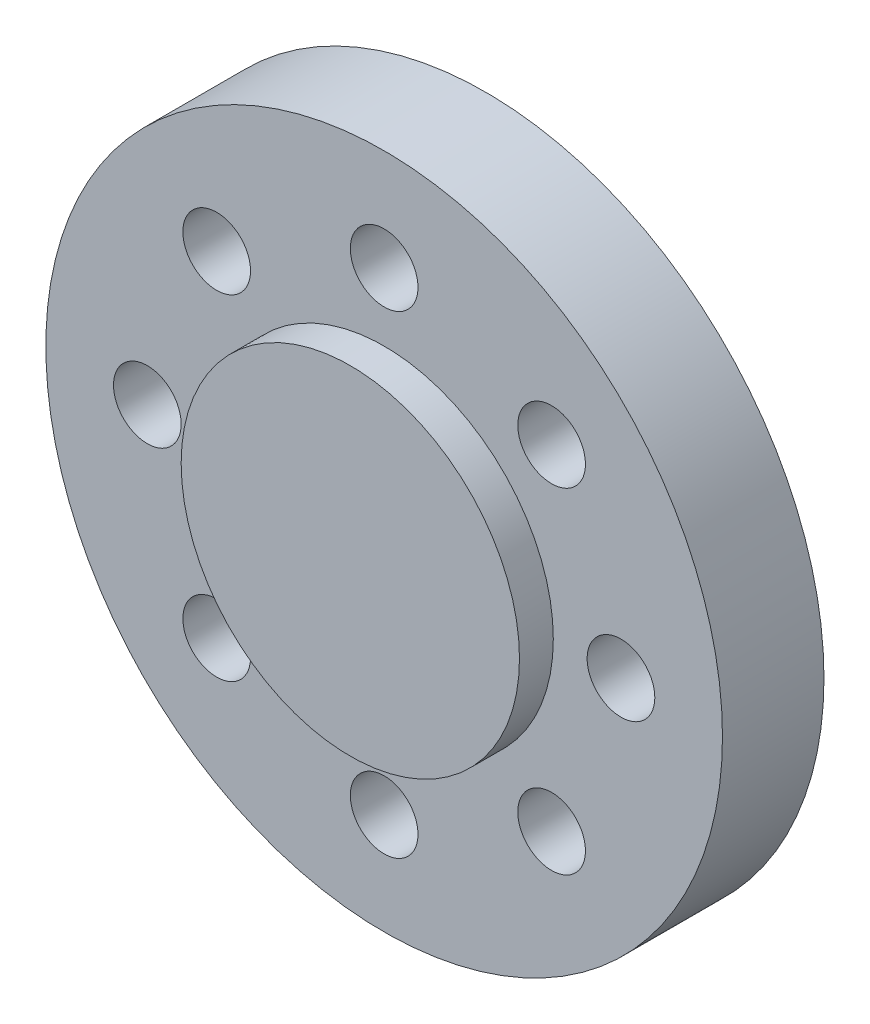
ISO-10303-21;
HEADER;
FILE_DESCRIPTION(('STEP AP214'),'2;1');
FILE_NAME('part.step','',(''),(''),'','','');
FILE_SCHEMA(('AUTOMOTIVE_DESIGN { 1 0 10303 214 1 1 1 1 }'));
ENDSEC;
DATA;
#1=APPLICATION_CONTEXT('core data for automotive mechanical design processes');
#2=APPLICATION_PROTOCOL_DEFINITION('international standard','automotive_design',2000,#1);
#3=PRODUCT_CONTEXT('',#1,'mechanical');
#4=PRODUCT('Part','Part','',(#3));
#5=PRODUCT_RELATED_PRODUCT_CATEGORY('part','',(#4));
#6=PRODUCT_DEFINITION_FORMATION('','',#4);
#7=PRODUCT_DEFINITION_CONTEXT('part definition',#1,'design');
#8=PRODUCT_DEFINITION('design','',#6,#7);
#9=PRODUCT_DEFINITION_SHAPE('','',#8);
#10=(LENGTH_UNIT() NAMED_UNIT(*) SI_UNIT(.MILLI.,.METRE.));
#11=(NAMED_UNIT(*) PLANE_ANGLE_UNIT() SI_UNIT($,.RADIAN.));
#12=(NAMED_UNIT(*) SI_UNIT($,.STERADIAN.) SOLID_ANGLE_UNIT());
#13=UNCERTAINTY_MEASURE_WITH_UNIT(LENGTH_MEASURE(1.E-05),#10,'distance_accuracy_value','');
#14=(GEOMETRIC_REPRESENTATION_CONTEXT(3) GLOBAL_UNCERTAINTY_ASSIGNED_CONTEXT((#13)) GLOBAL_UNIT_ASSIGNED_CONTEXT((#10,
#11,#12)) REPRESENTATION_CONTEXT('',''));
#15=CARTESIAN_POINT('',(0.,0.,0.));
#16=DIRECTION('',(0.,0.,1.));
#17=DIRECTION('',(1.,0.,0.));
#18=AXIS2_PLACEMENT_3D('',#15,#16,#17);
#19=CARTESIAN_POINT('',(13.5170920211287,-11.1544342507645,36.));
#20=DIRECTION('',(0.,0.,1.));
#21=DIRECTION('',(1.,0.,0.));
#22=AXIS2_PLACEMENT_3D('',#19,#20,#21);
#23=PLANE('',#22);
#24=CARTESIAN_POINT('',(18.4668394894346,-6.20468678245874,36.));
#25=DIRECTION('',(0.,0.,1.));
#26=DIRECTION('',(1.,0.,0.));
#27=AXIS2_PLACEMENT_3D('',#24,#25,#26);
#28=CIRCLE('',#27,1.);
#29=CARTESIAN_POINT('',(19.4668394894346,-6.20468678245874,36.));
#30=VERTEX_POINT('',#29);
#31=EDGE_CURVE('E98',#30,#30,#28,.T.);
#32=ORIENTED_EDGE('',*,*,#31,.F.);
#33=EDGE_LOOP('',(#32));
#34=FACE_BOUND('',#33,.T.);
#35=CARTESIAN_POINT('',(13.5170920211288,-4.15443425076452,36.));
#36=DIRECTION('',(0.,0.,1.));
#37=DIRECTION('',(1.,0.,0.));
#38=AXIS2_PLACEMENT_3D('',#35,#36,#37);
#39=CIRCLE('',#38,1.);
#40=CARTESIAN_POINT('',(14.5170920211288,-4.15443425076452,36.));
#41=VERTEX_POINT('',#40);
#42=EDGE_CURVE('E92',#41,#41,#39,.T.);
#43=ORIENTED_EDGE('',*,*,#42,.F.);
#44=EDGE_LOOP('',(#43));
#45=FACE_BOUND('',#44,.T.);
#46=CARTESIAN_POINT('',(8.56734455282293,-6.20468678245864,36.));
#47=DIRECTION('',(0.,0.,1.));
#48=DIRECTION('',(1.,0.,0.));
#49=AXIS2_PLACEMENT_3D('',#46,#47,#48);
#50=CIRCLE('',#49,1.);
#51=CARTESIAN_POINT('',(9.56734455282293,-6.20468678245864,36.));
#52=VERTEX_POINT('',#51);
#53=EDGE_CURVE('E86',#52,#52,#50,.T.);
#54=ORIENTED_EDGE('',*,*,#53,.F.);
#55=EDGE_LOOP('',(#54));
#56=FACE_BOUND('',#55,.T.);
#57=CARTESIAN_POINT('',(6.51709202112872,-11.1544342507645,36.));
#58=DIRECTION('',(0.,0.,1.));
#59=DIRECTION('',(1.,0.,0.));
#60=AXIS2_PLACEMENT_3D('',#57,#58,#59);
#61=CIRCLE('',#60,1.);
#62=CARTESIAN_POINT('',(7.51709202112872,-11.1544342507645,36.));
#63=VERTEX_POINT('',#62);
#64=EDGE_CURVE('E80',#63,#63,#61,.T.);
#65=ORIENTED_EDGE('',*,*,#64,.F.);
#66=EDGE_LOOP('',(#65));
#67=FACE_BOUND('',#66,.T.);
#68=CARTESIAN_POINT('',(8.56734455282286,-16.1041817190703,36.));
#69=DIRECTION('',(0.,0.,1.));
#70=DIRECTION('',(1.,0.,0.));
#71=AXIS2_PLACEMENT_3D('',#68,#69,#70);
#72=CIRCLE('',#71,1.);
#73=CARTESIAN_POINT('',(9.56734455282286,-16.1041817190703,36.));
#74=VERTEX_POINT('',#73);
#75=EDGE_CURVE('E74',#74,#74,#72,.T.);
#76=ORIENTED_EDGE('',*,*,#75,.F.);
#77=EDGE_LOOP('',(#76));
#78=FACE_BOUND('',#77,.T.);
#79=CARTESIAN_POINT('',(13.5170920211287,-18.1544342507645,36.));
#80=DIRECTION('',(0.,0.,1.));
#81=DIRECTION('',(1.,0.,0.));
#82=AXIS2_PLACEMENT_3D('',#79,#80,#81);
#83=CIRCLE('',#82,0.999999999999997);
#84=CARTESIAN_POINT('',(14.5170920211287,-18.1544342507645,36.));
#85=VERTEX_POINT('',#84);
#86=EDGE_CURVE('E68',#85,#85,#83,.T.);
#87=ORIENTED_EDGE('',*,*,#86,.F.);
#88=EDGE_LOOP('',(#87));
#89=FACE_BOUND('',#88,.T.);
#90=CARTESIAN_POINT('',(18.4668394894345,-16.1041817190704,36.));
#91=DIRECTION('',(0.,0.,1.));
#92=DIRECTION('',(1.,0.,0.));
#93=AXIS2_PLACEMENT_3D('',#90,#91,#92);
#94=CIRCLE('',#93,1.);
#95=CARTESIAN_POINT('',(19.4668394894345,-16.1041817190704,36.));
#96=VERTEX_POINT('',#95);
#97=EDGE_CURVE('E62',#96,#96,#94,.T.);
#98=ORIENTED_EDGE('',*,*,#97,.F.);
#99=EDGE_LOOP('',(#98));
#100=FACE_BOUND('',#99,.T.);
#101=CARTESIAN_POINT('',(20.5170920211287,-11.1544342507645,36.));
#102=DIRECTION('',(0.,0.,1.));
#103=DIRECTION('',(1.,0.,0.));
#104=AXIS2_PLACEMENT_3D('',#101,#102,#103);
#105=CIRCLE('',#104,1.);
#106=CARTESIAN_POINT('',(21.5170920211287,-11.1544342507645,36.));
#107=VERTEX_POINT('',#106);
#108=EDGE_CURVE('E56',#107,#107,#105,.T.);
#109=ORIENTED_EDGE('',*,*,#108,.F.);
#110=EDGE_LOOP('',(#109));
#111=FACE_BOUND('',#110,.T.);
#112=CARTESIAN_POINT('',(13.5170920211287,-11.1544342507645,36.));
#113=DIRECTION('',(0.,0.,1.));
#114=DIRECTION('',(1.,0.,0.));
#115=AXIS2_PLACEMENT_3D('',#112,#113,#114);
#116=CIRCLE('',#115,10.);
#117=CARTESIAN_POINT('',(23.5170920211287,-11.1544342507645,36.));
#118=VERTEX_POINT('',#117);
#119=EDGE_CURVE('E43',#118,#118,#116,.T.);
#120=ORIENTED_EDGE('',*,*,#119,.T.);
#121=EDGE_LOOP('',(#120));
#122=FACE_BOUND('',#121,.T.);
#123=CARTESIAN_POINT('',(13.5170920211287,-11.1544342507645,36.));
#124=DIRECTION('',(0.,0.,1.));
#125=DIRECTION('',(1.,0.,0.));
#126=AXIS2_PLACEMENT_3D('',#123,#124,#125);
#127=CIRCLE('',#126,5.);
#128=CARTESIAN_POINT('',(18.5170920211287,-11.1544342507645,36.));
#129=VERTEX_POINT('',#128);
#130=EDGE_CURVE('E50',#129,#129,#127,.T.);
#131=ORIENTED_EDGE('',*,*,#130,.F.);
#132=EDGE_LOOP('',(#131));
#133=FACE_BOUND('',#132,.T.);
#134=ADVANCED_FACE('F32',(#34,#45,#56,#67,#78,#89,#100,#111,#122,#133),#23,.T.);
#135=CARTESIAN_POINT('',(13.5170920211287,-11.1544342507645,36.));
#136=DIRECTION('',(0.,0.,-1.));
#137=DIRECTION('',(-1.,0.,0.));
#138=AXIS2_PLACEMENT_3D('',#135,#136,#137);
#139=CYLINDRICAL_SURFACE('',#138,3.);
#140=CARTESIAN_POINT('',(13.5170920211287,-11.1544342507645,32.5));
#141=DIRECTION('',(0.,0.,-1.));
#142=DIRECTION('',(-1.,0.,0.));
#143=AXIS2_PLACEMENT_3D('',#140,#141,#142);
#144=CIRCLE('',#143,3.);
#145=CARTESIAN_POINT('',(10.5170920211287,-11.1544342507645,32.5));
#146=VERTEX_POINT('',#145);
#147=EDGE_CURVE('E101',#146,#146,#144,.T.);
#148=ORIENTED_EDGE('',*,*,#147,.F.);
#149=EDGE_LOOP('',(#148));
#150=FACE_BOUND('',#149,.T.);
#151=CARTESIAN_POINT('',(13.5170920211287,-11.1544342507645,33.));
#152=DIRECTION('',(0.,0.,1.));
#153=DIRECTION('',(1.,0.,0.));
#154=AXIS2_PLACEMENT_3D('',#151,#152,#153);
#155=CIRCLE('',#154,3.);
#156=CARTESIAN_POINT('',(16.5170920211287,-11.1544342507645,33.));
#157=VERTEX_POINT('',#156);
#158=EDGE_CURVE('E10',#157,#157,#155,.T.);
#159=ORIENTED_EDGE('',*,*,#158,.F.);
#160=EDGE_LOOP('',(#159));
#161=FACE_BOUND('',#160,.T.);
#162=ADVANCED_FACE('F34',(#150,#161),#139,.T.);
#163=CARTESIAN_POINT('',(13.5170920211287,-11.1544342507645,33.));
#164=DIRECTION('',(0.,0.,1.));
#165=DIRECTION('',(1.,0.,0.));
#166=AXIS2_PLACEMENT_3D('',#163,#164,#165);
#167=PLANE('',#166);
#168=CARTESIAN_POINT('',(18.4668394894346,-6.20468678245874,33.));
#169=DIRECTION('',(0.,0.,1.));
#170=DIRECTION('',(1.,0.,0.));
#171=AXIS2_PLACEMENT_3D('',#168,#169,#170);
#172=CIRCLE('',#171,1.);
#173=CARTESIAN_POINT('',(19.4668394894346,-6.20468678245874,33.));
#174=VERTEX_POINT('',#173);
#175=EDGE_CURVE('E95',#174,#174,#172,.T.);
#176=ORIENTED_EDGE('',*,*,#175,.T.);
#177=EDGE_LOOP('',(#176));
#178=FACE_BOUND('',#177,.T.);
#179=CARTESIAN_POINT('',(13.5170920211288,-4.15443425076452,33.));
#180=DIRECTION('',(0.,0.,1.));
#181=DIRECTION('',(1.,0.,0.));
#182=AXIS2_PLACEMENT_3D('',#179,#180,#181);
#183=CIRCLE('',#182,1.);
#184=CARTESIAN_POINT('',(14.5170920211288,-4.15443425076452,33.));
#185=VERTEX_POINT('',#184);
#186=EDGE_CURVE('E89',#185,#185,#183,.T.);
#187=ORIENTED_EDGE('',*,*,#186,.T.);
#188=EDGE_LOOP('',(#187));
#189=FACE_BOUND('',#188,.T.);
#190=CARTESIAN_POINT('',(8.56734455282293,-6.20468678245864,33.));
#191=DIRECTION('',(0.,0.,1.));
#192=DIRECTION('',(1.,0.,0.));
#193=AXIS2_PLACEMENT_3D('',#190,#191,#192);
#194=CIRCLE('',#193,1.);
#195=CARTESIAN_POINT('',(9.56734455282293,-6.20468678245864,33.));
#196=VERTEX_POINT('',#195);
#197=EDGE_CURVE('E83',#196,#196,#194,.T.);
#198=ORIENTED_EDGE('',*,*,#197,.T.);
#199=EDGE_LOOP('',(#198));
#200=FACE_BOUND('',#199,.T.);
#201=CARTESIAN_POINT('',(6.51709202112872,-11.1544342507645,33.));
#202=DIRECTION('',(0.,0.,1.));
#203=DIRECTION('',(1.,0.,0.));
#204=AXIS2_PLACEMENT_3D('',#201,#202,#203);
#205=CIRCLE('',#204,1.);
#206=CARTESIAN_POINT('',(7.51709202112872,-11.1544342507645,33.));
#207=VERTEX_POINT('',#206);
#208=EDGE_CURVE('E77',#207,#207,#205,.T.);
#209=ORIENTED_EDGE('',*,*,#208,.T.);
#210=EDGE_LOOP('',(#209));
#211=FACE_BOUND('',#210,.T.);
#212=CARTESIAN_POINT('',(8.56734455282286,-16.1041817190703,33.));
#213=DIRECTION('',(0.,0.,1.));
#214=DIRECTION('',(1.,0.,0.));
#215=AXIS2_PLACEMENT_3D('',#212,#213,#214);
#216=CIRCLE('',#215,1.);
#217=CARTESIAN_POINT('',(9.56734455282286,-16.1041817190703,33.));
#218=VERTEX_POINT('',#217);
#219=EDGE_CURVE('E71',#218,#218,#216,.T.);
#220=ORIENTED_EDGE('',*,*,#219,.T.);
#221=EDGE_LOOP('',(#220));
#222=FACE_BOUND('',#221,.T.);
#223=CARTESIAN_POINT('',(13.5170920211287,-18.1544342507645,33.));
#224=DIRECTION('',(0.,0.,1.));
#225=DIRECTION('',(1.,0.,0.));
#226=AXIS2_PLACEMENT_3D('',#223,#224,#225);
#227=CIRCLE('',#226,0.999999999999997);
#228=CARTESIAN_POINT('',(14.5170920211287,-18.1544342507645,33.));
#229=VERTEX_POINT('',#228);
#230=EDGE_CURVE('E65',#229,#229,#227,.T.);
#231=ORIENTED_EDGE('',*,*,#230,.T.);
#232=EDGE_LOOP('',(#231));
#233=FACE_BOUND('',#232,.T.);
#234=CARTESIAN_POINT('',(18.4668394894345,-16.1041817190704,33.));
#235=DIRECTION('',(0.,0.,1.));
#236=DIRECTION('',(1.,0.,0.));
#237=AXIS2_PLACEMENT_3D('',#234,#235,#236);
#238=CIRCLE('',#237,1.);
#239=CARTESIAN_POINT('',(19.4668394894345,-16.1041817190704,33.));
#240=VERTEX_POINT('',#239);
#241=EDGE_CURVE('E59',#240,#240,#238,.T.);
#242=ORIENTED_EDGE('',*,*,#241,.T.);
#243=EDGE_LOOP('',(#242));
#244=FACE_BOUND('',#243,.T.);
#245=CARTESIAN_POINT('',(20.5170920211287,-11.1544342507645,33.));
#246=DIRECTION('',(0.,0.,1.));
#247=DIRECTION('',(1.,0.,0.));
#248=AXIS2_PLACEMENT_3D('',#245,#246,#247);
#249=CIRCLE('',#248,1.);
#250=CARTESIAN_POINT('',(21.5170920211287,-11.1544342507645,33.));
#251=VERTEX_POINT('',#250);
#252=EDGE_CURVE('E53',#251,#251,#249,.T.);
#253=ORIENTED_EDGE('',*,*,#252,.T.);
#254=EDGE_LOOP('',(#253));
#255=FACE_BOUND('',#254,.T.);
#256=CARTESIAN_POINT('',(13.5170920211287,-11.1544342507645,33.));
#257=DIRECTION('',(0.,0.,1.));
#258=DIRECTION('',(1.,0.,0.));
#259=AXIS2_PLACEMENT_3D('',#256,#257,#258);
#260=CIRCLE('',#259,10.);
#261=CARTESIAN_POINT('',(23.5170920211287,-11.1544342507645,33.));
#262=VERTEX_POINT('',#261);
#263=EDGE_CURVE('E39',#262,#262,#260,.T.);
#264=ORIENTED_EDGE('',*,*,#263,.F.);
#265=EDGE_LOOP('',(#264));
#266=FACE_BOUND('',#265,.T.);
#267=ORIENTED_EDGE('',*,*,#158,.T.);
#268=EDGE_LOOP('',(#267));
#269=FACE_BOUND('',#268,.T.);
#270=ADVANCED_FACE('F111',(#178,#189,#200,#211,#222,#233,#244,#255,#266,#269),#167,.F.);
#271=CARTESIAN_POINT('',(13.5170920211287,-11.1544342507645,33.));
#272=DIRECTION('',(0.,0.,1.));
#273=DIRECTION('',(1.,0.,0.));
#274=AXIS2_PLACEMENT_3D('',#271,#272,#273);
#275=CYLINDRICAL_SURFACE('',#274,10.);
#276=ORIENTED_EDGE('',*,*,#263,.T.);
#277=EDGE_LOOP('',(#276));
#278=FACE_BOUND('',#277,.T.);
#279=ORIENTED_EDGE('',*,*,#119,.F.);
#280=EDGE_LOOP('',(#279));
#281=FACE_BOUND('',#280,.T.);
#282=ADVANCED_FACE('F116',(#278,#281),#275,.T.);
#283=CARTESIAN_POINT('',(13.5170920211287,-11.1544342507645,37.));
#284=DIRECTION('',(0.,0.,-1.));
#285=DIRECTION('',(-1.,0.,0.));
#286=AXIS2_PLACEMENT_3D('',#283,#284,#285);
#287=CYLINDRICAL_SURFACE('',#286,5.);
#288=CARTESIAN_POINT('',(13.5170920211287,-11.1544342507645,37.));
#289=DIRECTION('',(0.,0.,1.));
#290=DIRECTION('',(1.,0.,0.));
#291=AXIS2_PLACEMENT_3D('',#288,#289,#290);
#292=CIRCLE('',#291,5.);
#293=CARTESIAN_POINT('',(18.5170920211287,-11.1544342507645,37.));
#294=VERTEX_POINT('',#293);
#295=EDGE_CURVE('E48',#294,#294,#292,.T.);
#296=ORIENTED_EDGE('',*,*,#295,.F.);
#297=EDGE_LOOP('',(#296));
#298=FACE_BOUND('',#297,.T.);
#299=ORIENTED_EDGE('',*,*,#130,.T.);
#300=EDGE_LOOP('',(#299));
#301=FACE_BOUND('',#300,.T.);
#302=ADVANCED_FACE('F126',(#298,#301),#287,.T.);
#303=CARTESIAN_POINT('',(13.5170920211287,-11.1544342507645,37.));
#304=DIRECTION('',(0.,0.,1.));
#305=DIRECTION('',(1.,0.,0.));
#306=AXIS2_PLACEMENT_3D('',#303,#304,#305);
#307=PLANE('',#306);
#308=ORIENTED_EDGE('',*,*,#295,.T.);
#309=EDGE_LOOP('',(#308));
#310=FACE_BOUND('',#309,.T.);
#311=ADVANCED_FACE('F130',(#310),#307,.T.);
#312=CARTESIAN_POINT('',(20.5170920211287,-11.1544342507645,33.));
#313=DIRECTION('',(0.,0.,1.));
#314=DIRECTION('',(1.,0.,0.));
#315=AXIS2_PLACEMENT_3D('',#312,#313,#314);
#316=CYLINDRICAL_SURFACE('',#315,1.);
#317=ORIENTED_EDGE('',*,*,#252,.F.);
#318=EDGE_LOOP('',(#317));
#319=FACE_BOUND('',#318,.T.);
#320=ORIENTED_EDGE('',*,*,#108,.T.);
#321=EDGE_LOOP('',(#320));
#322=FACE_BOUND('',#321,.T.);
#323=ADVANCED_FACE('F134',(#319,#322),#316,.F.);
#324=CARTESIAN_POINT('',(18.4668394894345,-16.1041817190704,33.));
#325=DIRECTION('',(0.,0.,1.));
#326=DIRECTION('',(1.,0.,0.));
#327=AXIS2_PLACEMENT_3D('',#324,#325,#326);
#328=CYLINDRICAL_SURFACE('',#327,1.);
#329=ORIENTED_EDGE('',*,*,#241,.F.);
#330=EDGE_LOOP('',(#329));
#331=FACE_BOUND('',#330,.T.);
#332=ORIENTED_EDGE('',*,*,#97,.T.);
#333=EDGE_LOOP('',(#332));
#334=FACE_BOUND('',#333,.T.);
#335=ADVANCED_FACE('F138',(#331,#334),#328,.F.);
#336=CARTESIAN_POINT('',(13.5170920211287,-18.1544342507645,33.));
#337=DIRECTION('',(0.,0.,1.));
#338=DIRECTION('',(1.,0.,0.));
#339=AXIS2_PLACEMENT_3D('',#336,#337,#338);
#340=CYLINDRICAL_SURFACE('',#339,0.999999999999997);
#341=ORIENTED_EDGE('',*,*,#230,.F.);
#342=EDGE_LOOP('',(#341));
#343=FACE_BOUND('',#342,.T.);
#344=ORIENTED_EDGE('',*,*,#86,.T.);
#345=EDGE_LOOP('',(#344));
#346=FACE_BOUND('',#345,.T.);
#347=ADVANCED_FACE('F142',(#343,#346),#340,.F.);
#348=CARTESIAN_POINT('',(8.56734455282286,-16.1041817190703,33.));
#349=DIRECTION('',(0.,0.,1.));
#350=DIRECTION('',(1.,0.,0.));
#351=AXIS2_PLACEMENT_3D('',#348,#349,#350);
#352=CYLINDRICAL_SURFACE('',#351,1.);
#353=ORIENTED_EDGE('',*,*,#219,.F.);
#354=EDGE_LOOP('',(#353));
#355=FACE_BOUND('',#354,.T.);
#356=ORIENTED_EDGE('',*,*,#75,.T.);
#357=EDGE_LOOP('',(#356));
#358=FACE_BOUND('',#357,.T.);
#359=ADVANCED_FACE('F146',(#355,#358),#352,.F.);
#360=CARTESIAN_POINT('',(6.51709202112872,-11.1544342507645,33.));
#361=DIRECTION('',(0.,0.,1.));
#362=DIRECTION('',(1.,0.,0.));
#363=AXIS2_PLACEMENT_3D('',#360,#361,#362);
#364=CYLINDRICAL_SURFACE('',#363,1.);
#365=ORIENTED_EDGE('',*,*,#208,.F.);
#366=EDGE_LOOP('',(#365));
#367=FACE_BOUND('',#366,.T.);
#368=ORIENTED_EDGE('',*,*,#64,.T.);
#369=EDGE_LOOP('',(#368));
#370=FACE_BOUND('',#369,.T.);
#371=ADVANCED_FACE('F150',(#367,#370),#364,.F.);
#372=CARTESIAN_POINT('',(8.56734455282293,-6.20468678245864,33.));
#373=DIRECTION('',(0.,0.,1.));
#374=DIRECTION('',(1.,0.,0.));
#375=AXIS2_PLACEMENT_3D('',#372,#373,#374);
#376=CYLINDRICAL_SURFACE('',#375,1.);
#377=ORIENTED_EDGE('',*,*,#197,.F.);
#378=EDGE_LOOP('',(#377));
#379=FACE_BOUND('',#378,.T.);
#380=ORIENTED_EDGE('',*,*,#53,.T.);
#381=EDGE_LOOP('',(#380));
#382=FACE_BOUND('',#381,.T.);
#383=ADVANCED_FACE('F154',(#379,#382),#376,.F.);
#384=CARTESIAN_POINT('',(13.5170920211288,-4.15443425076452,33.));
#385=DIRECTION('',(0.,0.,1.));
#386=DIRECTION('',(1.,0.,0.));
#387=AXIS2_PLACEMENT_3D('',#384,#385,#386);
#388=CYLINDRICAL_SURFACE('',#387,1.);
#389=ORIENTED_EDGE('',*,*,#186,.F.);
#390=EDGE_LOOP('',(#389));
#391=FACE_BOUND('',#390,.T.);
#392=ORIENTED_EDGE('',*,*,#42,.T.);
#393=EDGE_LOOP('',(#392));
#394=FACE_BOUND('',#393,.T.);
#395=ADVANCED_FACE('F158',(#391,#394),#388,.F.);
#396=CARTESIAN_POINT('',(18.4668394894346,-6.20468678245874,33.));
#397=DIRECTION('',(0.,0.,1.));
#398=DIRECTION('',(1.,0.,0.));
#399=AXIS2_PLACEMENT_3D('',#396,#397,#398);
#400=CYLINDRICAL_SURFACE('',#399,1.);
#401=ORIENTED_EDGE('',*,*,#175,.F.);
#402=EDGE_LOOP('',(#401));
#403=FACE_BOUND('',#402,.T.);
#404=ORIENTED_EDGE('',*,*,#31,.T.);
#405=EDGE_LOOP('',(#404));
#406=FACE_BOUND('',#405,.T.);
#407=ADVANCED_FACE('F162',(#403,#406),#400,.F.);
#408=CARTESIAN_POINT('',(0.,0.,32.5));
#409=DIRECTION('',(0.,0.,-1.));
#410=DIRECTION('',(-1.,0.,0.));
#411=AXIS2_PLACEMENT_3D('',#408,#409,#410);
#412=PLANE('',#411);
#413=ORIENTED_EDGE('',*,*,#147,.T.);
#414=EDGE_LOOP('',(#413));
#415=FACE_BOUND('',#414,.T.);
#416=ADVANCED_FACE('F107',(#415),#412,.T.);
#417=CLOSED_SHELL('',(#134,#162,#270,#282,#302,#311,#323,#335,#347,#359,#371,#383,#395,#407,#416));
#418=MANIFOLD_SOLID_BREP('B2',#417);
#419=ADVANCED_BREP_SHAPE_REPRESENTATION('',(#18,#418),#14);
#420=SHAPE_DEFINITION_REPRESENTATION(#9,#419);
ENDSEC;
END-ISO-10303-21;
